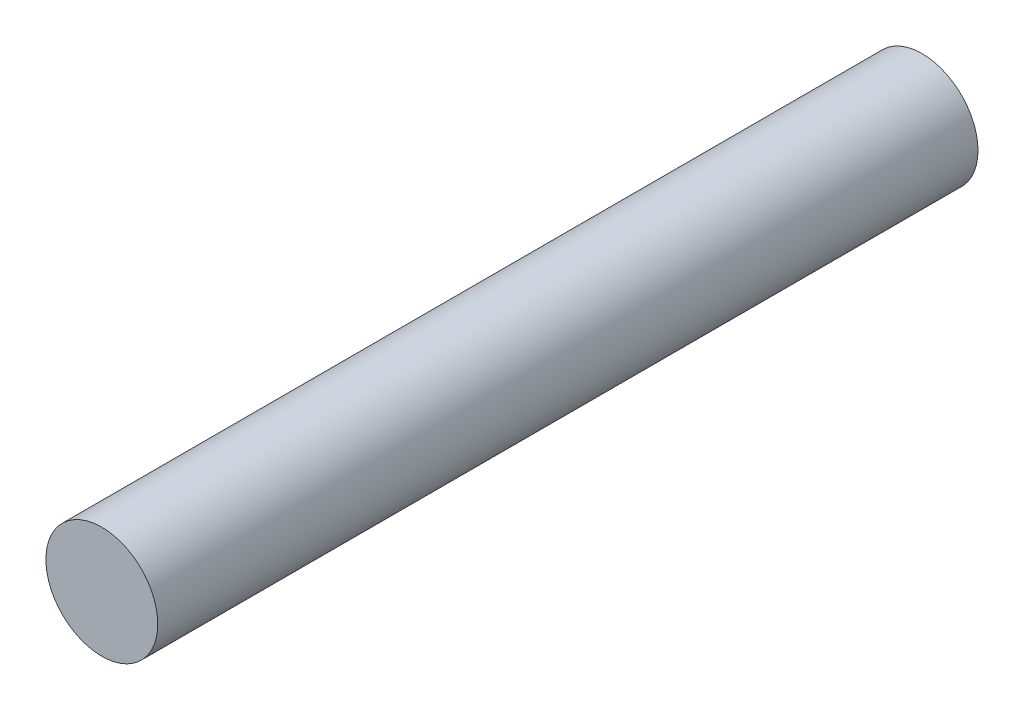
ISO-10303-21;
HEADER;
FILE_DESCRIPTION(('STEP AP214'),'2;1');
FILE_NAME('part.step','',(''),(''),'','','');
FILE_SCHEMA(('AUTOMOTIVE_DESIGN { 1 0 10303 214 1 1 1 1 }'));
ENDSEC;
DATA;
#1=APPLICATION_CONTEXT('core data for automotive mechanical design processes');
#2=APPLICATION_PROTOCOL_DEFINITION('international standard','automotive_design',2000,#1);
#3=PRODUCT_CONTEXT('',#1,'mechanical');
#4=PRODUCT('Part','Part','',(#3));
#5=PRODUCT_RELATED_PRODUCT_CATEGORY('part','',(#4));
#6=PRODUCT_DEFINITION_FORMATION('','',#4);
#7=PRODUCT_DEFINITION_CONTEXT('part definition',#1,'design');
#8=PRODUCT_DEFINITION('design','',#6,#7);
#9=PRODUCT_DEFINITION_SHAPE('','',#8);
#10=(LENGTH_UNIT() NAMED_UNIT(*) SI_UNIT(.MILLI.,.METRE.));
#11=(NAMED_UNIT(*) PLANE_ANGLE_UNIT() SI_UNIT($,.RADIAN.));
#12=(NAMED_UNIT(*) SI_UNIT($,.STERADIAN.) SOLID_ANGLE_UNIT());
#13=UNCERTAINTY_MEASURE_WITH_UNIT(LENGTH_MEASURE(1.E-05),#10,'distance_accuracy_value','');
#14=(GEOMETRIC_REPRESENTATION_CONTEXT(3) GLOBAL_UNCERTAINTY_ASSIGNED_CONTEXT((#13)) GLOBAL_UNIT_ASSIGNED_CONTEXT((#10,
#11,#12)) REPRESENTATION_CONTEXT('',''));
#15=CARTESIAN_POINT('',(0.,0.,0.));
#16=DIRECTION('',(0.,0.,1.));
#17=DIRECTION('',(1.,0.,0.));
#18=AXIS2_PLACEMENT_3D('',#15,#16,#17);
#19=CARTESIAN_POINT('',(0.,0.,27.5));
#20=DIRECTION('',(0.,0.,-1.));
#21=DIRECTION('',(-1.,0.,0.));
#22=AXIS2_PLACEMENT_3D('',#19,#20,#21);
#23=CYLINDRICAL_SURFACE('',#22,3.75);
#24=CARTESIAN_POINT('',(0.,0.,27.5));
#25=DIRECTION('',(0.,0.,1.));
#26=DIRECTION('',(1.,0.,0.));
#27=AXIS2_PLACEMENT_3D('',#24,#25,#26);
#28=CIRCLE('',#27,3.75);
#29=CARTESIAN_POINT('',(3.75,0.,27.5));
#30=VERTEX_POINT('',#29);
#31=EDGE_CURVE('E10',#30,#30,#28,.T.);
#32=ORIENTED_EDGE('',*,*,#31,.F.);
#33=EDGE_LOOP('',(#32));
#34=FACE_BOUND('',#33,.T.);
#35=CARTESIAN_POINT('',(0.,0.,-27.5));
#36=DIRECTION('',(0.,0.,1.));
#37=DIRECTION('',(1.,0.,0.));
#38=AXIS2_PLACEMENT_3D('',#35,#36,#37);
#39=CIRCLE('',#38,3.75);
#40=CARTESIAN_POINT('',(3.75,0.,-27.5));
#41=VERTEX_POINT('',#40);
#42=EDGE_CURVE('E44',#41,#41,#39,.T.);
#43=ORIENTED_EDGE('',*,*,#42,.T.);
#44=EDGE_LOOP('',(#43));
#45=FACE_BOUND('',#44,.T.);
#46=ADVANCED_FACE('F41',(#34,#45),#23,.T.);
#47=CARTESIAN_POINT('',(0.,0.,27.5));
#48=DIRECTION('',(0.,0.,1.));
#49=DIRECTION('',(1.,0.,0.));
#50=AXIS2_PLACEMENT_3D('',#47,#48,#49);
#51=PLANE('',#50);
#52=ORIENTED_EDGE('',*,*,#31,.T.);
#53=EDGE_LOOP('',(#52));
#54=FACE_BOUND('',#53,.T.);
#55=ADVANCED_FACE('F60',(#54),#51,.T.);
#56=CARTESIAN_POINT('',(0.,0.,-27.5));
#57=DIRECTION('',(0.,0.,1.));
#58=DIRECTION('',(1.,0.,0.));
#59=AXIS2_PLACEMENT_3D('',#56,#57,#58);
#60=PLANE('',#59);
#61=ORIENTED_EDGE('',*,*,#42,.F.);
#62=EDGE_LOOP('',(#61));
#63=FACE_BOUND('',#62,.T.);
#64=ADVANCED_FACE('F58',(#63),#60,.F.);
#65=CLOSED_SHELL('',(#46,#55,#64));
#66=MANIFOLD_SOLID_BREP('B2',#65);
#67=ADVANCED_BREP_SHAPE_REPRESENTATION('',(#18,#66),#14);
#68=SHAPE_DEFINITION_REPRESENTATION(#9,#67);
ENDSEC;
END-ISO-10303-21;
